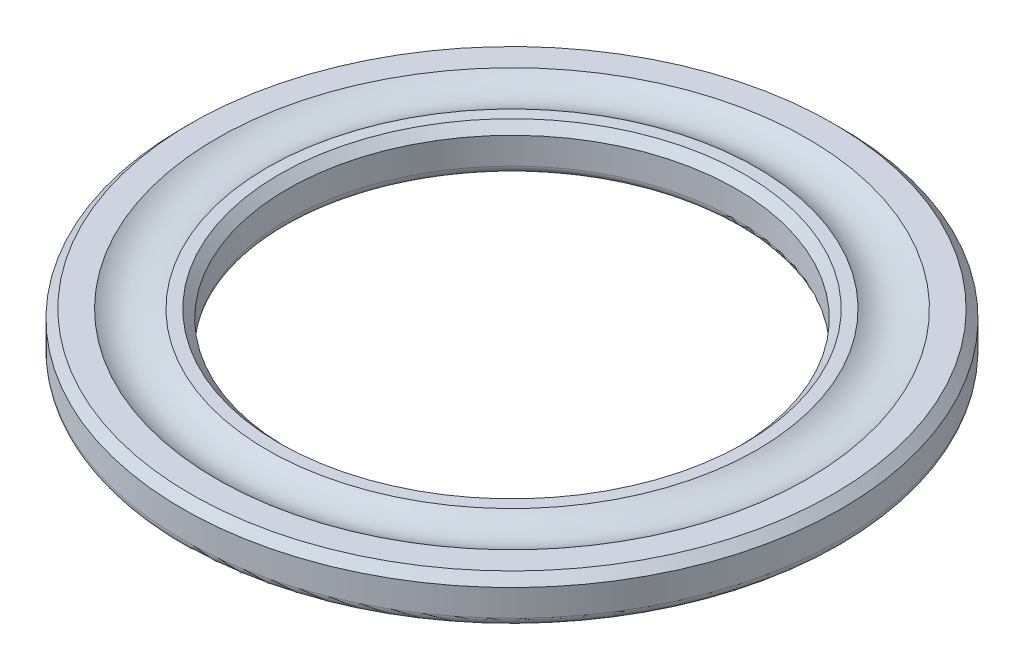
ISO-10303-21;
HEADER;
FILE_DESCRIPTION(('STEP AP214'),'2;1');
FILE_NAME('part.step','',(''),(''),'','','');
FILE_SCHEMA(('AUTOMOTIVE_DESIGN { 1 0 10303 214 1 1 1 1 }'));
ENDSEC;
DATA;
#1=APPLICATION_CONTEXT('core data for automotive mechanical design processes');
#2=APPLICATION_PROTOCOL_DEFINITION('international standard','automotive_design',2000,#1);
#3=PRODUCT_CONTEXT('',#1,'mechanical');
#4=PRODUCT('Part','Part','',(#3));
#5=PRODUCT_RELATED_PRODUCT_CATEGORY('part','',(#4));
#6=PRODUCT_DEFINITION_FORMATION('','',#4);
#7=PRODUCT_DEFINITION_CONTEXT('part definition',#1,'design');
#8=PRODUCT_DEFINITION('design','',#6,#7);
#9=PRODUCT_DEFINITION_SHAPE('','',#8);
#10=(LENGTH_UNIT() NAMED_UNIT(*) SI_UNIT(.MILLI.,.METRE.));
#11=(NAMED_UNIT(*) PLANE_ANGLE_UNIT() SI_UNIT($,.RADIAN.));
#12=(NAMED_UNIT(*) SI_UNIT($,.STERADIAN.) SOLID_ANGLE_UNIT());
#13=UNCERTAINTY_MEASURE_WITH_UNIT(LENGTH_MEASURE(1.E-05),#10,'distance_accuracy_value','');
#14=(GEOMETRIC_REPRESENTATION_CONTEXT(3) GLOBAL_UNCERTAINTY_ASSIGNED_CONTEXT((#13)) GLOBAL_UNIT_ASSIGNED_CONTEXT((#10,
#11,#12)) REPRESENTATION_CONTEXT('',''));
#15=CARTESIAN_POINT('',(0.,0.,0.));
#16=DIRECTION('',(0.,0.,1.));
#17=DIRECTION('',(1.,0.,0.));
#18=AXIS2_PLACEMENT_3D('',#15,#16,#17);
#19=CARTESIAN_POINT('',(19.75,0.,0.));
#20=DIRECTION('',(0.,-1.,0.));
#21=DIRECTION('',(-1.,0.,0.));
#22=AXIS2_PLACEMENT_3D('',#19,#20,#21);
#23=PLANE('',#22);
#24=CARTESIAN_POINT('',(0.,0.,0.));
#25=DIRECTION('',(0.,1.,0.));
#26=DIRECTION('',(1.,0.,0.));
#27=AXIS2_PLACEMENT_3D('',#24,#25,#26);
#28=CIRCLE('',#27,16.6);
#29=CARTESIAN_POINT('',(16.6,0.,0.));
#30=VERTEX_POINT('',#29);
#31=EDGE_CURVE('E11',#30,#30,#28,.T.);
#32=ORIENTED_EDGE('',*,*,#31,.T.);
#33=EDGE_LOOP('',(#32));
#34=FACE_BOUND('',#33,.T.);
#35=CARTESIAN_POINT('',(0.,0.,0.));
#36=DIRECTION('',(0.,1.,0.));
#37=DIRECTION('',(1.,0.,0.));
#38=AXIS2_PLACEMENT_3D('',#35,#36,#37);
#39=CIRCLE('',#38,22.9);
#40=CARTESIAN_POINT('',(22.9,0.,0.));
#41=VERTEX_POINT('',#40);
#42=EDGE_CURVE('E56',#41,#41,#39,.T.);
#43=ORIENTED_EDGE('',*,*,#42,.F.);
#44=EDGE_LOOP('',(#43));
#45=FACE_BOUND('',#44,.T.);
#46=ADVANCED_FACE('F16',(#34,#45),#23,.T.);
#47=CARTESIAN_POINT('',(0.,0.6,0.));
#48=DIRECTION('',(0.,1.,0.));
#49=DIRECTION('',(0.,0.,1.));
#50=AXIS2_PLACEMENT_3D('',#47,#48,#49);
#51=TOROIDAL_SURFACE('',#50,16.6,0.6);
#52=CARTESIAN_POINT('',(0.,0.6,0.));
#53=DIRECTION('',(0.,1.,0.));
#54=DIRECTION('',(1.,0.,0.));
#55=AXIS2_PLACEMENT_3D('',#52,#53,#54);
#56=CIRCLE('',#55,16.);
#57=CARTESIAN_POINT('',(16.,0.6,0.));
#58=VERTEX_POINT('',#57);
#59=EDGE_CURVE('E26',#58,#58,#56,.T.);
#60=ORIENTED_EDGE('',*,*,#59,.T.);
#61=EDGE_LOOP('',(#60));
#62=FACE_BOUND('',#61,.T.);
#63=ORIENTED_EDGE('',*,*,#31,.F.);
#64=EDGE_LOOP('',(#63));
#65=FACE_BOUND('',#64,.T.);
#66=ADVANCED_FACE('F84',(#62,#65),#51,.T.);
#67=CARTESIAN_POINT('',(0.,1.55,0.));
#68=DIRECTION('',(0.,-1.,0.));
#69=DIRECTION('',(1.,0.,0.));
#70=AXIS2_PLACEMENT_3D('',#67,#68,#69);
#71=CYLINDRICAL_SURFACE('',#70,16.);
#72=CARTESIAN_POINT('',(0.,2.5,0.));
#73=DIRECTION('',(0.,1.,0.));
#74=DIRECTION('',(1.,0.,0.));
#75=AXIS2_PLACEMENT_3D('',#72,#73,#74);
#76=CIRCLE('',#75,16.);
#77=CARTESIAN_POINT('',(16.,2.5,0.));
#78=VERTEX_POINT('',#77);
#79=EDGE_CURVE('E80',#78,#78,#76,.T.);
#80=ORIENTED_EDGE('',*,*,#79,.T.);
#81=EDGE_LOOP('',(#80));
#82=FACE_BOUND('',#81,.T.);
#83=ORIENTED_EDGE('',*,*,#59,.F.);
#84=EDGE_LOOP('',(#83));
#85=FACE_BOUND('',#84,.T.);
#86=ADVANCED_FACE('F87',(#82,#85),#71,.F.);
#87=CARTESIAN_POINT('',(0.,2.8,0.));
#88=DIRECTION('',(0.,1.,0.));
#89=DIRECTION('',(1.,0.,0.));
#90=AXIS2_PLACEMENT_3D('',#87,#88,#89);
#91=CONICAL_SURFACE('',#90,16.3,0.785398163397449);
#92=CARTESIAN_POINT('',(0.,3.1,0.));
#93=DIRECTION('',(0.,1.,0.));
#94=DIRECTION('',(1.,0.,0.));
#95=AXIS2_PLACEMENT_3D('',#92,#93,#94);
#96=CIRCLE('',#95,16.6);
#97=CARTESIAN_POINT('',(16.6,3.1,0.));
#98=VERTEX_POINT('',#97);
#99=EDGE_CURVE('E20',#98,#98,#96,.T.);
#100=ORIENTED_EDGE('',*,*,#99,.T.);
#101=EDGE_LOOP('',(#100));
#102=FACE_BOUND('',#101,.T.);
#103=ORIENTED_EDGE('',*,*,#79,.F.);
#104=EDGE_LOOP('',(#103));
#105=FACE_BOUND('',#104,.T.);
#106=ADVANCED_FACE('F89',(#102,#105),#91,.F.);
#107=CARTESIAN_POINT('',(17.025,3.1,0.));
#108=DIRECTION('',(0.,1.,0.));
#109=DIRECTION('',(1.,0.,0.));
#110=AXIS2_PLACEMENT_3D('',#107,#108,#109);
#111=PLANE('',#110);
#112=CARTESIAN_POINT('',(0.,3.1,0.));
#113=DIRECTION('',(0.,1.,0.));
#114=DIRECTION('',(1.,0.,0.));
#115=AXIS2_PLACEMENT_3D('',#112,#113,#114);
#116=CIRCLE('',#115,17.45);
#117=CARTESIAN_POINT('',(17.45,3.1,0.));
#118=VERTEX_POINT('',#117);
#119=EDGE_CURVE('E64',#118,#118,#116,.T.);
#120=ORIENTED_EDGE('',*,*,#119,.T.);
#121=EDGE_LOOP('',(#120));
#122=FACE_BOUND('',#121,.T.);
#123=ORIENTED_EDGE('',*,*,#99,.F.);
#124=EDGE_LOOP('',(#123));
#125=FACE_BOUND('',#124,.T.);
#126=ADVANCED_FACE('F97',(#122,#125),#111,.T.);
#127=CARTESIAN_POINT('',(0.,5.5,0.));
#128=DIRECTION('',(0.,1.,0.));
#129=DIRECTION('',(0.,0.,1.));
#130=AXIS2_PLACEMENT_3D('',#127,#128,#129);
#131=TOROIDAL_SURFACE('',#130,19.25,3.);
#132=CARTESIAN_POINT('',(0.,3.1,0.));
#133=DIRECTION('',(0.,1.,0.));
#134=DIRECTION('',(1.,0.,0.));
#135=AXIS2_PLACEMENT_3D('',#132,#133,#134);
#136=CIRCLE('',#135,21.05);
#137=CARTESIAN_POINT('',(21.05,3.1,0.));
#138=VERTEX_POINT('',#137);
#139=EDGE_CURVE('E68',#138,#138,#136,.T.);
#140=ORIENTED_EDGE('',*,*,#139,.T.);
#141=EDGE_LOOP('',(#140));
#142=FACE_BOUND('',#141,.T.);
#143=ORIENTED_EDGE('',*,*,#119,.F.);
#144=EDGE_LOOP('',(#143));
#145=FACE_BOUND('',#144,.T.);
#146=ADVANCED_FACE('F69',(#142,#145),#131,.F.);
#147=CARTESIAN_POINT('',(21.975,3.1,0.));
#148=DIRECTION('',(0.,1.,0.));
#149=DIRECTION('',(1.,0.,0.));
#150=AXIS2_PLACEMENT_3D('',#147,#148,#149);
#151=PLANE('',#150);
#152=CARTESIAN_POINT('',(0.,3.1,0.));
#153=DIRECTION('',(0.,1.,0.));
#154=DIRECTION('',(1.,0.,0.));
#155=AXIS2_PLACEMENT_3D('',#152,#153,#154);
#156=CIRCLE('',#155,22.9);
#157=CARTESIAN_POINT('',(22.9,3.1,0.));
#158=VERTEX_POINT('',#157);
#159=EDGE_CURVE('E72',#158,#158,#156,.T.);
#160=ORIENTED_EDGE('',*,*,#159,.T.);
#161=EDGE_LOOP('',(#160));
#162=FACE_BOUND('',#161,.T.);
#163=ORIENTED_EDGE('',*,*,#139,.F.);
#164=EDGE_LOOP('',(#163));
#165=FACE_BOUND('',#164,.T.);
#166=ADVANCED_FACE('F18',(#162,#165),#151,.T.);
#167=CARTESIAN_POINT('',(0.,2.8,0.));
#168=DIRECTION('',(0.,-1.,0.));
#169=DIRECTION('',(1.,0.,0.));
#170=AXIS2_PLACEMENT_3D('',#167,#168,#169);
#171=CONICAL_SURFACE('',#170,23.2,0.785398163397446);
#172=CARTESIAN_POINT('',(0.,2.5,0.));
#173=DIRECTION('',(0.,1.,0.));
#174=DIRECTION('',(1.,0.,0.));
#175=AXIS2_PLACEMENT_3D('',#172,#173,#174);
#176=CIRCLE('',#175,23.5);
#177=CARTESIAN_POINT('',(23.5,2.5,0.));
#178=VERTEX_POINT('',#177);
#179=EDGE_CURVE('E50',#178,#178,#176,.T.);
#180=ORIENTED_EDGE('',*,*,#179,.T.);
#181=EDGE_LOOP('',(#180));
#182=FACE_BOUND('',#181,.T.);
#183=ORIENTED_EDGE('',*,*,#159,.F.);
#184=EDGE_LOOP('',(#183));
#185=FACE_BOUND('',#184,.T.);
#186=ADVANCED_FACE('F106',(#182,#185),#171,.T.);
#187=CARTESIAN_POINT('',(0.,1.55,0.));
#188=DIRECTION('',(0.,-1.,0.));
#189=DIRECTION('',(1.,0.,0.));
#190=AXIS2_PLACEMENT_3D('',#187,#188,#189);
#191=CYLINDRICAL_SURFACE('',#190,23.5);
#192=CARTESIAN_POINT('',(0.,0.6,0.));
#193=DIRECTION('',(0.,1.,0.));
#194=DIRECTION('',(1.,0.,0.));
#195=AXIS2_PLACEMENT_3D('',#192,#193,#194);
#196=CIRCLE('',#195,23.5);
#197=CARTESIAN_POINT('',(23.5,0.6,0.));
#198=VERTEX_POINT('',#197);
#199=EDGE_CURVE('E77',#198,#198,#196,.T.);
#200=ORIENTED_EDGE('',*,*,#199,.T.);
#201=EDGE_LOOP('',(#200));
#202=FACE_BOUND('',#201,.T.);
#203=ORIENTED_EDGE('',*,*,#179,.F.);
#204=EDGE_LOOP('',(#203));
#205=FACE_BOUND('',#204,.T.);
#206=ADVANCED_FACE('F108',(#202,#205),#191,.T.);
#207=CARTESIAN_POINT('',(0.,0.6,0.));
#208=DIRECTION('',(0.,1.,0.));
#209=DIRECTION('',(0.,0.,1.));
#210=AXIS2_PLACEMENT_3D('',#207,#208,#209);
#211=TOROIDAL_SURFACE('',#210,22.9,0.6);
#212=ORIENTED_EDGE('',*,*,#42,.T.);
#213=EDGE_LOOP('',(#212));
#214=FACE_BOUND('',#213,.T.);
#215=ORIENTED_EDGE('',*,*,#199,.F.);
#216=EDGE_LOOP('',(#215));
#217=FACE_BOUND('',#216,.T.);
#218=ADVANCED_FACE('F120',(#214,#217),#211,.T.);
#219=CLOSED_SHELL('',(#46,#66,#86,#106,#126,#146,#166,#186,#206,#218));
#220=MANIFOLD_SOLID_BREP('B1',#219);
#221=ADVANCED_BREP_SHAPE_REPRESENTATION('',(#18,#220),#14);
#222=SHAPE_DEFINITION_REPRESENTATION(#9,#221);
ENDSEC;
END-ISO-10303-21;
